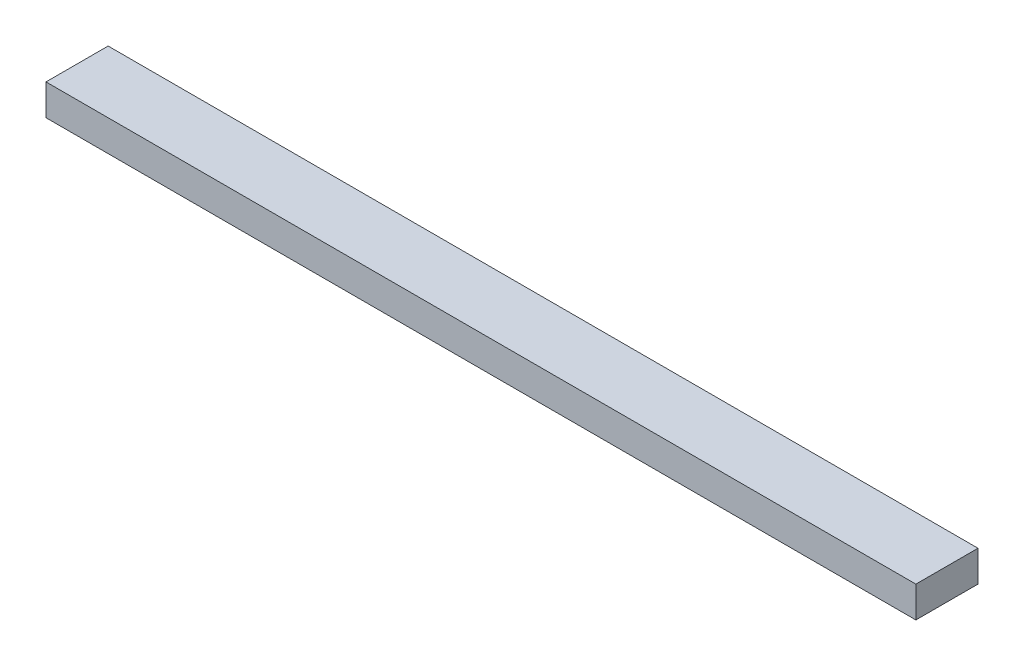
ISO-10303-21;
HEADER;
FILE_DESCRIPTION(('STEP AP214'),'2;1');
FILE_NAME('part.step','',(''),(''),'','','');
FILE_SCHEMA(('AUTOMOTIVE_DESIGN { 1 0 10303 214 1 1 1 1 }'));
ENDSEC;
DATA;
#1=APPLICATION_CONTEXT('core data for automotive mechanical design processes');
#2=APPLICATION_PROTOCOL_DEFINITION('international standard','automotive_design',2000,#1);
#3=PRODUCT_CONTEXT('',#1,'mechanical');
#4=PRODUCT('Part','Part','',(#3));
#5=PRODUCT_RELATED_PRODUCT_CATEGORY('part','',(#4));
#6=PRODUCT_DEFINITION_FORMATION('','',#4);
#7=PRODUCT_DEFINITION_CONTEXT('part definition',#1,'design');
#8=PRODUCT_DEFINITION('design','',#6,#7);
#9=PRODUCT_DEFINITION_SHAPE('','',#8);
#10=(LENGTH_UNIT() NAMED_UNIT(*) SI_UNIT(.MILLI.,.METRE.));
#11=(NAMED_UNIT(*) PLANE_ANGLE_UNIT() SI_UNIT($,.RADIAN.));
#12=(NAMED_UNIT(*) SI_UNIT($,.STERADIAN.) SOLID_ANGLE_UNIT());
#13=UNCERTAINTY_MEASURE_WITH_UNIT(LENGTH_MEASURE(1.E-05),#10,'distance_accuracy_value','');
#14=(GEOMETRIC_REPRESENTATION_CONTEXT(3) GLOBAL_UNCERTAINTY_ASSIGNED_CONTEXT((#13)) GLOBAL_UNIT_ASSIGNED_CONTEXT((#10,
#11,#12)) REPRESENTATION_CONTEXT('',''));
#15=CARTESIAN_POINT('',(0.,0.,0.));
#16=DIRECTION('',(0.,0.,1.));
#17=DIRECTION('',(1.,0.,0.));
#18=AXIS2_PLACEMENT_3D('',#15,#16,#17);
#19=CARTESIAN_POINT('',(560.,629.071886436259,-355.621757110109));
#20=DIRECTION('',(0.,0.,-1.));
#21=DIRECTION('',(-1.,0.,0.));
#22=AXIS2_PLACEMENT_3D('',#19,#20,#21);
#23=PLANE('',#22);
#24=DIRECTION('',(0.,-1.,0.));
#25=VECTOR('',#24,1.);
#26=CARTESIAN_POINT('',(0.,629.071886436259,-355.621757110109));
#27=LINE('',#26,#25);
#28=CARTESIAN_POINT('',(0.,629.071886436259,-355.621757110109));
#29=VERTEX_POINT('',#28);
#30=CARTESIAN_POINT('',(0.,609.071886436259,-355.621757110109));
#31=VERTEX_POINT('',#30);
#32=EDGE_CURVE('E96',#29,#31,#27,.T.);
#33=ORIENTED_EDGE('',*,*,#32,.T.);
#34=DIRECTION('',(-1.,0.,0.));
#35=VECTOR('',#34,1.);
#36=CARTESIAN_POINT('',(560.,609.071886436259,-355.621757110109));
#37=LINE('',#36,#35);
#38=CARTESIAN_POINT('',(560.,609.071886436259,-355.621757110109));
#39=VERTEX_POINT('',#38);
#40=EDGE_CURVE('E11',#39,#31,#37,.T.);
#41=ORIENTED_EDGE('',*,*,#40,.F.);
#42=DIRECTION('',(0.,-1.,0.));
#43=VECTOR('',#42,1.);
#44=CARTESIAN_POINT('',(560.,629.071886436259,-355.621757110109));
#45=LINE('',#44,#43);
#46=CARTESIAN_POINT('',(560.,629.071886436259,-355.621757110109));
#47=VERTEX_POINT('',#46);
#48=EDGE_CURVE('E84',#47,#39,#45,.T.);
#49=ORIENTED_EDGE('',*,*,#48,.F.);
#50=DIRECTION('',(-1.,0.,0.));
#51=VECTOR('',#50,1.);
#52=CARTESIAN_POINT('',(560.,629.071886436259,-355.621757110109));
#53=LINE('',#52,#51);
#54=EDGE_CURVE('E92',#47,#29,#53,.T.);
#55=ORIENTED_EDGE('',*,*,#54,.T.);
#56=EDGE_LOOP('',(#33,#41,#49,#55));
#57=FACE_BOUND('',#56,.T.);
#58=ADVANCED_FACE('F33',(#57),#23,.F.);
#59=CARTESIAN_POINT('',(560.,609.071886436259,-355.621757110109));
#60=DIRECTION('',(0.,1.,0.));
#61=DIRECTION('',(0.,0.,1.));
#62=AXIS2_PLACEMENT_3D('',#59,#60,#61);
#63=PLANE('',#62);
#64=DIRECTION('',(0.,0.,-1.));
#65=VECTOR('',#64,1.);
#66=CARTESIAN_POINT('',(0.,609.071886436259,-355.621757110109));
#67=LINE('',#66,#65);
#68=CARTESIAN_POINT('',(0.,609.071886436259,-395.621757110109));
#69=VERTEX_POINT('',#68);
#70=EDGE_CURVE('E88',#31,#69,#67,.T.);
#71=ORIENTED_EDGE('',*,*,#70,.T.);
#72=DIRECTION('',(-1.,0.,0.));
#73=VECTOR('',#72,1.);
#74=CARTESIAN_POINT('',(560.,609.071886436259,-395.621757110109));
#75=LINE('',#74,#73);
#76=CARTESIAN_POINT('',(560.,609.071886436259,-395.621757110109));
#77=VERTEX_POINT('',#76);
#78=EDGE_CURVE('E41',#77,#69,#75,.T.);
#79=ORIENTED_EDGE('',*,*,#78,.F.);
#80=DIRECTION('',(0.,0.,-1.));
#81=VECTOR('',#80,1.);
#82=CARTESIAN_POINT('',(560.,609.071886436259,-355.621757110109));
#83=LINE('',#82,#81);
#84=EDGE_CURVE('E79',#39,#77,#83,.T.);
#85=ORIENTED_EDGE('',*,*,#84,.F.);
#86=ORIENTED_EDGE('',*,*,#40,.T.);
#87=EDGE_LOOP('',(#71,#79,#85,#86));
#88=FACE_BOUND('',#87,.T.);
#89=ADVANCED_FACE('F87',(#88),#63,.F.);
#90=CARTESIAN_POINT('',(560.,629.071886436259,-395.621757110109));
#91=DIRECTION('',(0.,0.,1.));
#92=DIRECTION('',(1.,0.,0.));
#93=AXIS2_PLACEMENT_3D('',#90,#91,#92);
#94=PLANE('',#93);
#95=DIRECTION('',(0.,1.,0.));
#96=VECTOR('',#95,1.);
#97=CARTESIAN_POINT('',(0.,629.071886436259,-395.621757110109));
#98=LINE('',#97,#96);
#99=CARTESIAN_POINT('',(0.,629.071886436259,-395.621757110109));
#100=VERTEX_POINT('',#99);
#101=EDGE_CURVE('E66',#69,#100,#98,.T.);
#102=ORIENTED_EDGE('',*,*,#101,.T.);
#103=DIRECTION('',(-1.,0.,0.));
#104=VECTOR('',#103,1.);
#105=CARTESIAN_POINT('',(560.,629.071886436259,-395.621757110109));
#106=LINE('',#105,#104);
#107=CARTESIAN_POINT('',(560.,629.071886436259,-395.621757110109));
#108=VERTEX_POINT('',#107);
#109=EDGE_CURVE('E89',#108,#100,#106,.T.);
#110=ORIENTED_EDGE('',*,*,#109,.F.);
#111=DIRECTION('',(0.,1.,0.));
#112=VECTOR('',#111,1.);
#113=CARTESIAN_POINT('',(560.,629.071886436259,-395.621757110109));
#114=LINE('',#113,#112);
#115=EDGE_CURVE('E82',#77,#108,#114,.T.);
#116=ORIENTED_EDGE('',*,*,#115,.F.);
#117=ORIENTED_EDGE('',*,*,#78,.T.);
#118=EDGE_LOOP('',(#102,#110,#116,#117));
#119=FACE_BOUND('',#118,.T.);
#120=ADVANCED_FACE('F90',(#119),#94,.F.);
#121=CARTESIAN_POINT('',(560.,629.071886436259,-355.621757110109));
#122=DIRECTION('',(0.,-1.,0.));
#123=DIRECTION('',(0.,0.,-1.));
#124=AXIS2_PLACEMENT_3D('',#121,#122,#123);
#125=PLANE('',#124);
#126=DIRECTION('',(0.,0.,1.));
#127=VECTOR('',#126,1.);
#128=CARTESIAN_POINT('',(0.,629.071886436259,-355.621757110109));
#129=LINE('',#128,#127);
#130=EDGE_CURVE('E72',#100,#29,#129,.T.);
#131=ORIENTED_EDGE('',*,*,#130,.T.);
#132=ORIENTED_EDGE('',*,*,#54,.F.);
#133=DIRECTION('',(0.,0.,1.));
#134=VECTOR('',#133,1.);
#135=CARTESIAN_POINT('',(560.,629.071886436259,-355.621757110109));
#136=LINE('',#135,#134);
#137=EDGE_CURVE('E49',#108,#47,#136,.T.);
#138=ORIENTED_EDGE('',*,*,#137,.F.);
#139=ORIENTED_EDGE('',*,*,#109,.T.);
#140=EDGE_LOOP('',(#131,#132,#138,#139));
#141=FACE_BOUND('',#140,.T.);
#142=ADVANCED_FACE('F103',(#141),#125,.F.);
#143=CARTESIAN_POINT('',(560.,0.,0.));
#144=DIRECTION('',(1.,0.,0.));
#145=DIRECTION('',(0.,0.,-1.));
#146=AXIS2_PLACEMENT_3D('',#143,#144,#145);
#147=PLANE('',#146);
#148=ORIENTED_EDGE('',*,*,#48,.T.);
#149=ORIENTED_EDGE('',*,*,#84,.T.);
#150=ORIENTED_EDGE('',*,*,#115,.T.);
#151=ORIENTED_EDGE('',*,*,#137,.T.);
#152=EDGE_LOOP('',(#148,#149,#150,#151));
#153=FACE_BOUND('',#152,.T.);
#154=ADVANCED_FACE('F80',(#153),#147,.T.);
#155=CARTESIAN_POINT('',(0.,0.,0.));
#156=DIRECTION('',(1.,0.,0.));
#157=DIRECTION('',(0.,0.,-1.));
#158=AXIS2_PLACEMENT_3D('',#155,#156,#157);
#159=PLANE('',#158);
#160=ORIENTED_EDGE('',*,*,#32,.F.);
#161=ORIENTED_EDGE('',*,*,#130,.F.);
#162=ORIENTED_EDGE('',*,*,#101,.F.);
#163=ORIENTED_EDGE('',*,*,#70,.F.);
#164=EDGE_LOOP('',(#160,#161,#162,#163));
#165=FACE_BOUND('',#164,.T.);
#166=ADVANCED_FACE('F106',(#165),#159,.F.);
#167=CLOSED_SHELL('',(#58,#89,#120,#142,#154,#166));
#168=MANIFOLD_SOLID_BREP('B2',#167);
#169=ADVANCED_BREP_SHAPE_REPRESENTATION('',(#18,#168),#14);
#170=SHAPE_DEFINITION_REPRESENTATION(#9,#169);
ENDSEC;
END-ISO-10303-21;
